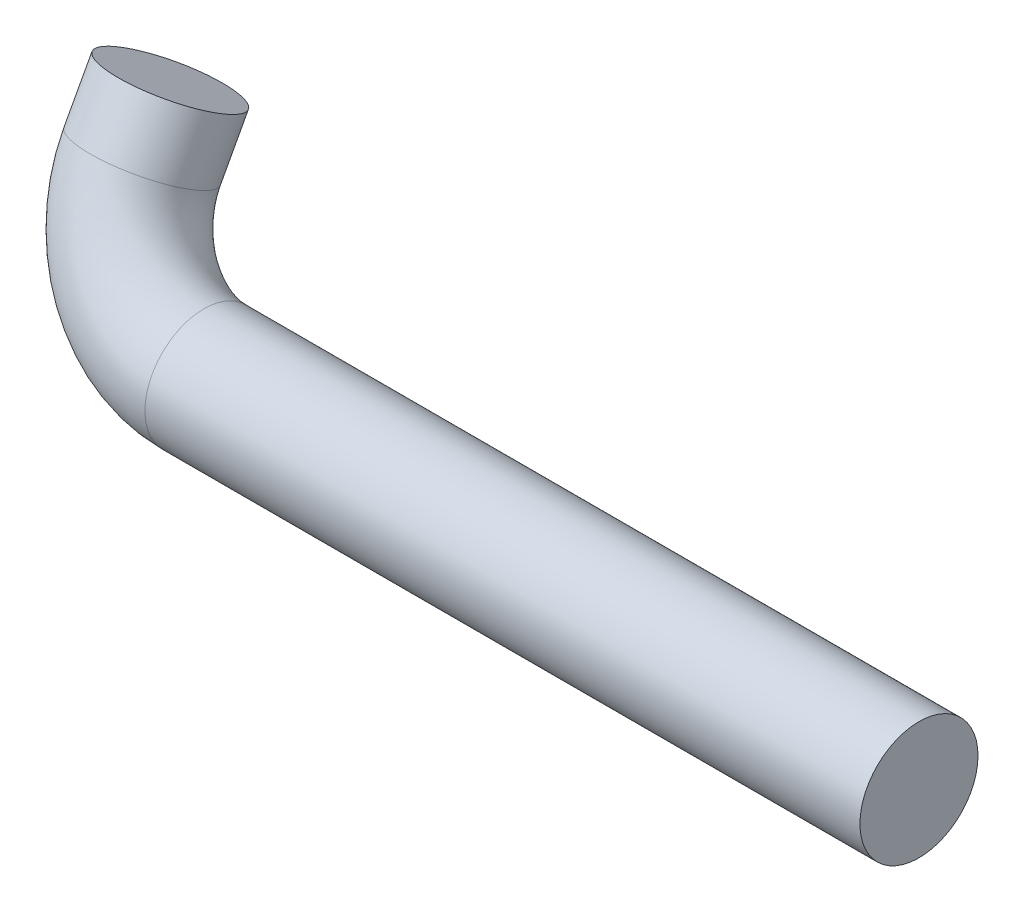
ISO-10303-21;
HEADER;
FILE_DESCRIPTION(('STEP AP214'),'2;1');
FILE_NAME('part.step','',(''),(''),'','','');
FILE_SCHEMA(('AUTOMOTIVE_DESIGN { 1 0 10303 214 1 1 1 1 }'));
ENDSEC;
DATA;
#1=APPLICATION_CONTEXT('core data for automotive mechanical design processes');
#2=APPLICATION_PROTOCOL_DEFINITION('international standard','automotive_design',2000,#1);
#3=PRODUCT_CONTEXT('',#1,'mechanical');
#4=PRODUCT('Part','Part','',(#3));
#5=PRODUCT_RELATED_PRODUCT_CATEGORY('part','',(#4));
#6=PRODUCT_DEFINITION_FORMATION('','',#4);
#7=PRODUCT_DEFINITION_CONTEXT('part definition',#1,'design');
#8=PRODUCT_DEFINITION('design','',#6,#7);
#9=PRODUCT_DEFINITION_SHAPE('','',#8);
#10=(LENGTH_UNIT() NAMED_UNIT(*) SI_UNIT(.MILLI.,.METRE.));
#11=(NAMED_UNIT(*) PLANE_ANGLE_UNIT() SI_UNIT($,.RADIAN.));
#12=(NAMED_UNIT(*) SI_UNIT($,.STERADIAN.) SOLID_ANGLE_UNIT());
#13=UNCERTAINTY_MEASURE_WITH_UNIT(LENGTH_MEASURE(1.E-05),#10,'distance_accuracy_value','');
#14=(GEOMETRIC_REPRESENTATION_CONTEXT(3) GLOBAL_UNCERTAINTY_ASSIGNED_CONTEXT((#13)) GLOBAL_UNIT_ASSIGNED_CONTEXT((#10,
#11,#12)) REPRESENTATION_CONTEXT('',''));
#15=CARTESIAN_POINT('',(0.,0.,0.));
#16=DIRECTION('',(0.,0.,1.));
#17=DIRECTION('',(1.,0.,0.));
#18=AXIS2_PLACEMENT_3D('',#15,#16,#17);
#19=CARTESIAN_POINT('',(56.7,-30.5788622935,14.207437460255));
#20=DIRECTION('',(1.,0.,0.));
#21=DIRECTION('',(0.,1.,0.));
#22=AXIS2_PLACEMENT_3D('',#19,#20,#21);
#23=PLANE('',#22);
#24=CARTESIAN_POINT('',(56.7,-30.5788622935,14.207437460255));
#25=DIRECTION('',(1.,0.,0.));
#26=DIRECTION('',(0.,-0.476365647654812,-0.879247274510653));
#27=AXIS2_PLACEMENT_3D('',#24,#25,#26);
#28=CIRCLE('',#27,1.5);
#29=CARTESIAN_POINT('',(56.7,-31.29341076498,12.888566548489));
#30=VERTEX_POINT('',#29);
#31=EDGE_CURVE('E9',#30,#30,#28,.T.);
#32=ORIENTED_EDGE('',*,*,#31,.T.);
#33=EDGE_LOOP('',(#32));
#34=FACE_BOUND('',#33,.T.);
#35=ADVANCED_FACE('F14',(#34),#23,.T.);
#36=CARTESIAN_POINT('',(35.525036876606,-26.6222495582,12.063792045809));
#37=DIRECTION('',(0.,-0.879247274510653,0.476365647654812));
#38=DIRECTION('',(-1.,0.,0.));
#39=AXIS2_PLACEMENT_3D('',#36,#37,#38);
#40=PLANE('',#39);
#41=CARTESIAN_POINT('',(35.525036876606,-26.6222495582,12.063792045809));
#42=DIRECTION('',(0.,-0.879247274510653,0.476365647654812));
#43=DIRECTION('',(0.,-0.476365647654812,-0.879247274510653));
#44=AXIS2_PLACEMENT_3D('',#41,#42,#43);
#45=CIRCLE('',#44,1.5);
#46=CARTESIAN_POINT('',(35.525036876606,-27.33679802968,10.744921134043));
#47=VERTEX_POINT('',#46);
#48=EDGE_CURVE('E47',#47,#47,#45,.T.);
#49=ORIENTED_EDGE('',*,*,#48,.F.);
#50=EDGE_LOOP('',(#49));
#51=FACE_BOUND('',#50,.T.);
#52=ADVANCED_FACE('F73',(#51),#40,.F.);
#53=CARTESIAN_POINT('',(38.525036876606,-30.5788622935,14.207437460255));
#54=DIRECTION('',(1.,0.,0.));
#55=DIRECTION('',(0.,-0.476365647654812,-0.879247274510653));
#56=AXIS2_PLACEMENT_3D('',#53,#54,#55);
#57=CYLINDRICAL_SURFACE('',#56,1.5);
#58=DIRECTION('',(1.,0.,0.));
#59=VECTOR('',#58,1.);
#60=CARTESIAN_POINT('',(38.525036876606,-31.29341076498,12.888566548489));
#61=LINE('',#60,#59);
#62=CARTESIAN_POINT('',(38.525036876606,-31.29341076498,12.888566548489));
#63=VERTEX_POINT('',#62);
#64=EDGE_CURVE('E25',#63,#30,#61,.T.);
#65=ORIENTED_EDGE('',*,*,#64,.T.);
#66=ORIENTED_EDGE('',*,*,#31,.F.);
#67=ORIENTED_EDGE('',*,*,#64,.F.);
#68=CARTESIAN_POINT('',(38.525036876606,-30.5788622935,14.207437460255));
#69=DIRECTION('',(-1.,0.,0.));
#70=DIRECTION('',(0.,-0.879247274510653,0.476365647654812));
#71=AXIS2_PLACEMENT_3D('',#68,#69,#70);
#72=CIRCLE('',#71,1.5);
#73=EDGE_CURVE('E58',#63,#63,#72,.T.);
#74=ORIENTED_EDGE('',*,*,#73,.F.);
#75=EDGE_LOOP('',(#65,#66,#67,#74));
#76=FACE_BOUND('',#75,.T.);
#77=ADVANCED_FACE('F71',(#76),#57,.T.);
#78=CARTESIAN_POINT('',(38.525036876606,-27.94112046996,12.778340517291));
#79=DIRECTION('',(0.,0.476365647654812,0.879247274510653));
#80=DIRECTION('',(-1.,0.,0.));
#81=AXIS2_PLACEMENT_3D('',#78,#79,#80);
#82=TOROIDAL_SURFACE('',#81,3.,1.5);
#83=CARTESIAN_POINT('',(38.525036876606,-28.65566894144,11.459469605525));
#84=DIRECTION('',(0.,0.476365647654812,0.879247274510653));
#85=DIRECTION('',(-1.,0.,0.));
#86=AXIS2_PLACEMENT_3D('',#83,#84,#85);
#87=CIRCLE('',#86,3.);
#88=CARTESIAN_POINT('',(35.525036876606,-28.65566894144,11.459469605525));
#89=VERTEX_POINT('',#88);
#90=EDGE_CURVE('E55',#89,#63,#87,.T.);
#91=ORIENTED_EDGE('',*,*,#90,.T.);
#92=ORIENTED_EDGE('',*,*,#73,.T.);
#93=ORIENTED_EDGE('',*,*,#90,.F.);
#94=CARTESIAN_POINT('',(35.525036876606,-27.94112046996,12.778340517291));
#95=DIRECTION('',(0.,-0.879247274510653,0.476365647654812));
#96=DIRECTION('',(0.,-0.476365647654812,-0.879247274510653));
#97=AXIS2_PLACEMENT_3D('',#94,#95,#96);
#98=CIRCLE('',#97,1.5);
#99=EDGE_CURVE('E18',#89,#89,#98,.T.);
#100=ORIENTED_EDGE('',*,*,#99,.T.);
#101=EDGE_LOOP('',(#91,#92,#93,#100));
#102=FACE_BOUND('',#101,.T.);
#103=ADVANCED_FACE('F16',(#102),#82,.T.);
#104=CARTESIAN_POINT('',(35.525036876606,-26.6222495582,12.063792045809));
#105=DIRECTION('',(0.,-0.879247274510653,0.476365647654812));
#106=DIRECTION('',(0.,-0.476365647654812,-0.879247274510653));
#107=AXIS2_PLACEMENT_3D('',#104,#105,#106);
#108=CYLINDRICAL_SURFACE('',#107,1.5);
#109=DIRECTION('',(0.,-0.879247274510653,0.476365647654812));
#110=VECTOR('',#109,1.);
#111=CARTESIAN_POINT('',(35.525036876606,-27.33679802968,10.744921134043));
#112=LINE('',#111,#110);
#113=EDGE_CURVE('E90',#47,#89,#112,.T.);
#114=ORIENTED_EDGE('',*,*,#113,.T.);
#115=ORIENTED_EDGE('',*,*,#99,.F.);
#116=ORIENTED_EDGE('',*,*,#113,.F.);
#117=ORIENTED_EDGE('',*,*,#48,.T.);
#118=EDGE_LOOP('',(#114,#115,#116,#117));
#119=FACE_BOUND('',#118,.T.);
#120=ADVANCED_FACE('F80',(#119),#108,.T.);
#121=CLOSED_SHELL('',(#35,#52,#77,#103,#120));
#122=MANIFOLD_SOLID_BREP('B1',#121);
#123=ADVANCED_BREP_SHAPE_REPRESENTATION('',(#18,#122),#14);
#124=SHAPE_DEFINITION_REPRESENTATION(#9,#123);
ENDSEC;
END-ISO-10303-21;
